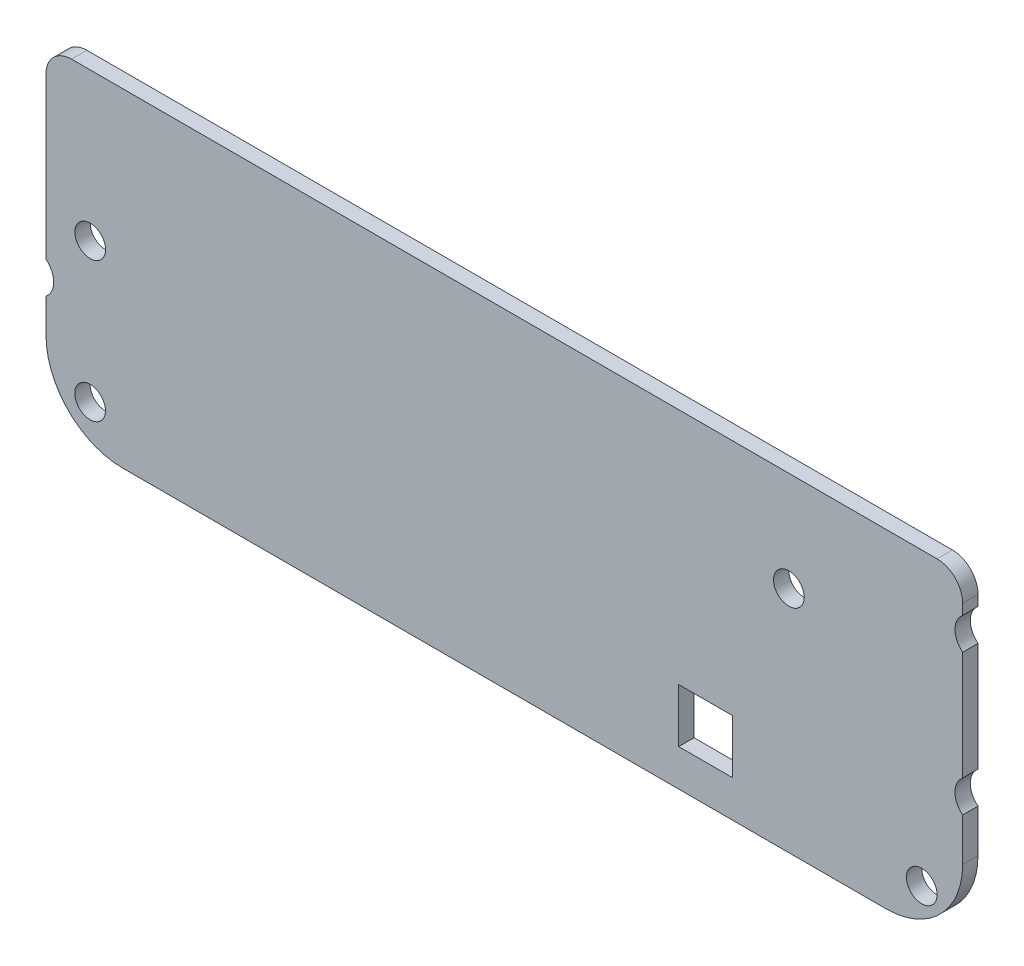
ISO-10303-21;
HEADER;
FILE_DESCRIPTION(('STEP AP214'),'2;1');
FILE_NAME('part.step','',(''),(''),'','','');
FILE_SCHEMA(('AUTOMOTIVE_DESIGN { 1 0 10303 214 1 1 1 1 }'));
ENDSEC;
DATA;
#1=APPLICATION_CONTEXT('core data for automotive mechanical design processes');
#2=APPLICATION_PROTOCOL_DEFINITION('international standard','automotive_design',2000,#1);
#3=PRODUCT_CONTEXT('',#1,'mechanical');
#4=PRODUCT('Part','Part','',(#3));
#5=PRODUCT_RELATED_PRODUCT_CATEGORY('part','',(#4));
#6=PRODUCT_DEFINITION_FORMATION('','',#4);
#7=PRODUCT_DEFINITION_CONTEXT('part definition',#1,'design');
#8=PRODUCT_DEFINITION('design','',#6,#7);
#9=PRODUCT_DEFINITION_SHAPE('','',#8);
#10=(LENGTH_UNIT() NAMED_UNIT(*) SI_UNIT(.MILLI.,.METRE.));
#11=(NAMED_UNIT(*) PLANE_ANGLE_UNIT() SI_UNIT($,.RADIAN.));
#12=(NAMED_UNIT(*) SI_UNIT($,.STERADIAN.) SOLID_ANGLE_UNIT());
#13=UNCERTAINTY_MEASURE_WITH_UNIT(LENGTH_MEASURE(1.E-05),#10,'distance_accuracy_value','');
#14=(GEOMETRIC_REPRESENTATION_CONTEXT(3) GLOBAL_UNCERTAINTY_ASSIGNED_CONTEXT((#13)) GLOBAL_UNIT_ASSIGNED_CONTEXT((#10,
#11,#12)) REPRESENTATION_CONTEXT('',''));
#15=CARTESIAN_POINT('',(0.,0.,0.));
#16=DIRECTION('',(0.,0.,1.));
#17=DIRECTION('',(1.,0.,0.));
#18=AXIS2_PLACEMENT_3D('',#15,#16,#17);
#19=CARTESIAN_POINT('',(103.101682981005,93.4022534083957,3.));
#20=DIRECTION('',(1.,0.,0.));
#21=DIRECTION('',(0.,1.,0.));
#22=AXIS2_PLACEMENT_3D('',#19,#20,#21);
#23=PLANE('',#22);
#24=DIRECTION('',(0.,-1.,0.));
#25=VECTOR('',#24,1.);
#26=CARTESIAN_POINT('',(103.101682981005,93.4022534083957,0.));
#27=LINE('',#26,#25);
#28=CARTESIAN_POINT('',(103.101682981005,137.632253408396,0.));
#29=VERTEX_POINT('',#28);
#30=CARTESIAN_POINT('',(103.101682981005,106.244752407595,0.));
#31=VERTEX_POINT('',#30);
#32=EDGE_CURVE('E281',#29,#31,#27,.T.);
#33=ORIENTED_EDGE('',*,*,#32,.T.);
#34=DIRECTION('',(0.,0.,1.));
#35=VECTOR('',#34,1.);
#36=CARTESIAN_POINT('',(103.101682981005,106.244752407595,-7.));
#37=LINE('',#36,#35);
#38=CARTESIAN_POINT('',(103.101682981005,106.244752407595,3.));
#39=VERTEX_POINT('',#38);
#40=EDGE_CURVE('E207',#31,#39,#37,.T.);
#41=ORIENTED_EDGE('',*,*,#40,.T.);
#42=DIRECTION('',(0.,-1.,0.));
#43=VECTOR('',#42,1.);
#44=CARTESIAN_POINT('',(103.101682981005,93.4022534083957,3.));
#45=LINE('',#44,#43);
#46=CARTESIAN_POINT('',(103.101682981005,137.632253408396,3.));
#47=VERTEX_POINT('',#46);
#48=EDGE_CURVE('E259',#47,#39,#45,.T.);
#49=ORIENTED_EDGE('',*,*,#48,.F.);
#50=DIRECTION('',(0.,0.,-1.));
#51=VECTOR('',#50,1.);
#52=CARTESIAN_POINT('',(103.101682981005,137.632253408396,3.));
#53=LINE('',#52,#51);
#54=EDGE_CURVE('E308',#47,#29,#53,.T.);
#55=ORIENTED_EDGE('',*,*,#54,.T.);
#56=EDGE_LOOP('',(#33,#41,#49,#55));
#57=FACE_BOUND('',#56,.T.);
#58=ADVANCED_FACE('F42',(#57),#23,.F.);
#59=CARTESIAN_POINT('',(282.271682981005,93.4022534083957,3.));
#60=DIRECTION('',(-1.,0.,0.));
#61=DIRECTION('',(0.,0.,1.));
#62=AXIS2_PLACEMENT_3D('',#59,#60,#61);
#63=PLANE('',#62);
#64=DIRECTION('',(0.,1.,0.));
#65=VECTOR('',#64,1.);
#66=CARTESIAN_POINT('',(282.271682981005,93.4022534083957,0.));
#67=LINE('',#66,#65);
#68=CARTESIAN_POINT('',(282.271682981005,108.024752407595,0.));
#69=VERTEX_POINT('',#68);
#70=CARTESIAN_POINT('',(282.271682981005,129.319754409196,0.));
#71=VERTEX_POINT('',#70);
#72=EDGE_CURVE('E293',#69,#71,#67,.T.);
#73=ORIENTED_EDGE('',*,*,#72,.T.);
#74=DIRECTION('',(0.,0.,1.));
#75=VECTOR('',#74,1.);
#76=CARTESIAN_POINT('',(282.271682981005,129.319754409196,-7.));
#77=LINE('',#76,#75);
#78=CARTESIAN_POINT('',(282.271682981005,129.319754409196,3.));
#79=VERTEX_POINT('',#78);
#80=EDGE_CURVE('E222',#71,#79,#77,.T.);
#81=ORIENTED_EDGE('',*,*,#80,.T.);
#82=DIRECTION('',(0.,1.,0.));
#83=VECTOR('',#82,1.);
#84=CARTESIAN_POINT('',(282.271682981005,93.4022534083957,3.));
#85=LINE('',#84,#83);
#86=CARTESIAN_POINT('',(282.271682981005,108.024752407595,3.));
#87=VERTEX_POINT('',#86);
#88=EDGE_CURVE('E273',#87,#79,#85,.T.);
#89=ORIENTED_EDGE('',*,*,#88,.F.);
#90=DIRECTION('',(0.,0.,1.));
#91=VECTOR('',#90,1.);
#92=CARTESIAN_POINT('',(282.271682981005,108.024752407595,-7.));
#93=LINE('',#92,#91);
#94=EDGE_CURVE('E214',#69,#87,#93,.T.);
#95=ORIENTED_EDGE('',*,*,#94,.F.);
#96=EDGE_LOOP('',(#73,#81,#89,#95));
#97=FACE_BOUND('',#96,.T.);
#98=ADVANCED_FACE('F368',(#97),#63,.F.);
#99=CARTESIAN_POINT('',(282.271682981005,93.4022534083957,0.));
#100=VERTEX_POINT('',#99);
#101=CARTESIAN_POINT('',(282.271682981005,101.779754409196,0.));
#102=VERTEX_POINT('',#101);
#103=EDGE_CURVE('E254',#100,#102,#67,.T.);
#104=ORIENTED_EDGE('',*,*,#103,.T.);
#105=DIRECTION('',(0.,0.,1.));
#106=VECTOR('',#105,1.);
#107=CARTESIAN_POINT('',(282.271682981005,101.779754409196,-7.));
#108=LINE('',#107,#106);
#109=CARTESIAN_POINT('',(282.271682981005,101.779754409196,3.));
#110=VERTEX_POINT('',#109);
#111=EDGE_CURVE('E215',#102,#110,#108,.T.);
#112=ORIENTED_EDGE('',*,*,#111,.T.);
#113=CARTESIAN_POINT('',(282.271682981005,93.4022534083957,3.));
#114=VERTEX_POINT('',#113);
#115=EDGE_CURVE('E269',#114,#110,#85,.T.);
#116=ORIENTED_EDGE('',*,*,#115,.F.);
#117=DIRECTION('',(0.,0.,-1.));
#118=VECTOR('',#117,1.);
#119=CARTESIAN_POINT('',(282.271682981005,93.4022534083957,3.));
#120=LINE('',#119,#118);
#121=EDGE_CURVE('E296',#114,#100,#120,.T.);
#122=ORIENTED_EDGE('',*,*,#121,.T.);
#123=EDGE_LOOP('',(#104,#112,#116,#122));
#124=FACE_BOUND('',#123,.T.);
#125=ADVANCED_FACE('F374',(#124),#63,.F.);
#126=CARTESIAN_POINT('',(277.271682981005,137.632253408396,3.));
#127=DIRECTION('',(0.,0.,-1.));
#128=DIRECTION('',(-1.,0.,0.));
#129=AXIS2_PLACEMENT_3D('',#126,#127,#128);
#130=CYLINDRICAL_SURFACE('',#129,5.);
#131=CARTESIAN_POINT('',(277.271682981005,137.632253408396,0.));
#132=DIRECTION('',(0.,0.,1.));
#133=DIRECTION('',(-1.,0.,0.));
#134=AXIS2_PLACEMENT_3D('',#131,#132,#133);
#135=CIRCLE('',#134,5.);
#136=CARTESIAN_POINT('',(282.271682981005,137.632253408396,0.));
#137=VERTEX_POINT('',#136);
#138=CARTESIAN_POINT('',(277.271682981005,142.632253408396,0.));
#139=VERTEX_POINT('',#138);
#140=EDGE_CURVE('E249',#137,#139,#135,.T.);
#141=ORIENTED_EDGE('',*,*,#140,.T.);
#142=DIRECTION('',(0.,0.,-1.));
#143=VECTOR('',#142,1.);
#144=CARTESIAN_POINT('',(277.271682981005,142.632253408396,3.));
#145=LINE('',#144,#143);
#146=CARTESIAN_POINT('',(277.271682981005,142.632253408396,3.));
#147=VERTEX_POINT('',#146);
#148=EDGE_CURVE('E314',#147,#139,#145,.T.);
#149=ORIENTED_EDGE('',*,*,#148,.F.);
#150=CARTESIAN_POINT('',(277.271682981005,137.632253408396,3.));
#151=DIRECTION('',(0.,0.,1.));
#152=DIRECTION('',(-1.,0.,0.));
#153=AXIS2_PLACEMENT_3D('',#150,#151,#152);
#154=CIRCLE('',#153,5.);
#155=CARTESIAN_POINT('',(282.271682981005,137.632253408396,3.));
#156=VERTEX_POINT('',#155);
#157=EDGE_CURVE('E250',#156,#147,#154,.T.);
#158=ORIENTED_EDGE('',*,*,#157,.F.);
#159=DIRECTION('',(0.,0.,-1.));
#160=VECTOR('',#159,1.);
#161=CARTESIAN_POINT('',(282.271682981005,137.632253408396,3.));
#162=LINE('',#161,#160);
#163=EDGE_CURVE('E272',#156,#137,#162,.T.);
#164=ORIENTED_EDGE('',*,*,#163,.T.);
#165=EDGE_LOOP('',(#141,#149,#158,#164));
#166=FACE_BOUND('',#165,.T.);
#167=ADVANCED_FACE('F44',(#166),#130,.T.);
#168=CARTESIAN_POINT('',(108.101682981005,142.632253408396,3.));
#169=DIRECTION('',(0.,-1.,0.));
#170=DIRECTION('',(0.,0.,-1.));
#171=AXIS2_PLACEMENT_3D('',#168,#169,#170);
#172=PLANE('',#171);
#173=DIRECTION('',(-1.,0.,0.));
#174=VECTOR('',#173,1.);
#175=CARTESIAN_POINT('',(108.101682981005,142.632253408396,0.));
#176=LINE('',#175,#174);
#177=CARTESIAN_POINT('',(108.101682981005,142.632253408396,0.));
#178=VERTEX_POINT('',#177);
#179=EDGE_CURVE('E276',#139,#178,#176,.T.);
#180=ORIENTED_EDGE('',*,*,#179,.T.);
#181=DIRECTION('',(0.,0.,-1.));
#182=VECTOR('',#181,1.);
#183=CARTESIAN_POINT('',(108.101682981005,142.632253408396,3.));
#184=LINE('',#183,#182);
#185=CARTESIAN_POINT('',(108.101682981005,142.632253408396,3.));
#186=VERTEX_POINT('',#185);
#187=EDGE_CURVE('E311',#186,#178,#184,.T.);
#188=ORIENTED_EDGE('',*,*,#187,.F.);
#189=DIRECTION('',(-1.,0.,0.));
#190=VECTOR('',#189,1.);
#191=CARTESIAN_POINT('',(108.101682981005,142.632253408396,3.));
#192=LINE('',#191,#190);
#193=EDGE_CURVE('E253',#147,#186,#192,.T.);
#194=ORIENTED_EDGE('',*,*,#193,.F.);
#195=ORIENTED_EDGE('',*,*,#148,.T.);
#196=EDGE_LOOP('',(#180,#188,#194,#195));
#197=FACE_BOUND('',#196,.T.);
#198=ADVANCED_FACE('F357',(#197),#172,.F.);
#199=CARTESIAN_POINT('',(108.101682981005,137.632253408396,3.));
#200=DIRECTION('',(0.,0.,-1.));
#201=DIRECTION('',(-1.,0.,0.));
#202=AXIS2_PLACEMENT_3D('',#199,#200,#201);
#203=CYLINDRICAL_SURFACE('',#202,5.);
#204=CARTESIAN_POINT('',(108.101682981005,137.632253408396,0.));
#205=DIRECTION('',(0.,0.,1.));
#206=DIRECTION('',(-1.,0.,0.));
#207=AXIS2_PLACEMENT_3D('',#204,#205,#206);
#208=CIRCLE('',#207,5.);
#209=EDGE_CURVE('E278',#178,#29,#208,.T.);
#210=ORIENTED_EDGE('',*,*,#209,.T.);
#211=ORIENTED_EDGE('',*,*,#54,.F.);
#212=CARTESIAN_POINT('',(108.101682981005,137.632253408396,3.));
#213=DIRECTION('',(0.,0.,1.));
#214=DIRECTION('',(-1.,0.,0.));
#215=AXIS2_PLACEMENT_3D('',#212,#213,#214);
#216=CIRCLE('',#215,5.);
#217=EDGE_CURVE('E256',#186,#47,#216,.T.);
#218=ORIENTED_EDGE('',*,*,#217,.F.);
#219=ORIENTED_EDGE('',*,*,#187,.T.);
#220=EDGE_LOOP('',(#210,#211,#218,#219));
#221=FACE_BOUND('',#220,.T.);
#222=ADVANCED_FACE('F353',(#221),#203,.T.);
#223=CARTESIAN_POINT('',(103.101682981005,99.9997544091964,3.));
#224=VERTEX_POINT('',#223);
#225=CARTESIAN_POINT('',(103.101682981005,93.4022534083957,3.));
#226=VERTEX_POINT('',#225);
#227=EDGE_CURVE('E258',#224,#226,#45,.T.);
#228=ORIENTED_EDGE('',*,*,#227,.F.);
#229=DIRECTION('',(0.,0.,1.));
#230=VECTOR('',#229,1.);
#231=CARTESIAN_POINT('',(103.101682981005,99.9997544091964,-7.));
#232=LINE('',#231,#230);
#233=CARTESIAN_POINT('',(103.101682981005,99.9997544091964,0.));
#234=VERTEX_POINT('',#233);
#235=EDGE_CURVE('E204',#234,#224,#232,.T.);
#236=ORIENTED_EDGE('',*,*,#235,.F.);
#237=CARTESIAN_POINT('',(103.101682981005,93.4022534083957,0.));
#238=VERTEX_POINT('',#237);
#239=EDGE_CURVE('E280',#234,#238,#27,.T.);
#240=ORIENTED_EDGE('',*,*,#239,.T.);
#241=DIRECTION('',(0.,0.,-1.));
#242=VECTOR('',#241,1.);
#243=CARTESIAN_POINT('',(103.101682981005,93.4022534083957,3.));
#244=LINE('',#243,#242);
#245=EDGE_CURVE('E305',#226,#238,#244,.T.);
#246=ORIENTED_EDGE('',*,*,#245,.F.);
#247=EDGE_LOOP('',(#228,#236,#240,#246));
#248=FACE_BOUND('',#247,.T.);
#249=ADVANCED_FACE('F327',(#248),#23,.F.);
#250=CARTESIAN_POINT('',(118.101682981005,93.4022534083957,3.));
#251=DIRECTION('',(0.,0.,-1.));
#252=DIRECTION('',(-1.,0.,0.));
#253=AXIS2_PLACEMENT_3D('',#250,#251,#252);
#254=CYLINDRICAL_SURFACE('',#253,15.);
#255=CARTESIAN_POINT('',(118.101682981005,93.4022534083957,0.));
#256=DIRECTION('',(0.,0.,1.));
#257=DIRECTION('',(-1.,0.,0.));
#258=AXIS2_PLACEMENT_3D('',#255,#256,#257);
#259=CIRCLE('',#258,15.);
#260=CARTESIAN_POINT('',(118.101682981005,78.4022534083957,0.));
#261=VERTEX_POINT('',#260);
#262=EDGE_CURVE('E284',#238,#261,#259,.T.);
#263=ORIENTED_EDGE('',*,*,#262,.T.);
#264=DIRECTION('',(0.,0.,-1.));
#265=VECTOR('',#264,1.);
#266=CARTESIAN_POINT('',(118.101682981005,78.4022534083957,3.));
#267=LINE('',#266,#265);
#268=CARTESIAN_POINT('',(118.101682981005,78.4022534083957,3.));
#269=VERTEX_POINT('',#268);
#270=EDGE_CURVE('E302',#269,#261,#267,.T.);
#271=ORIENTED_EDGE('',*,*,#270,.F.);
#272=CARTESIAN_POINT('',(118.101682981005,93.4022534083957,3.));
#273=DIRECTION('',(0.,0.,1.));
#274=DIRECTION('',(-1.,0.,0.));
#275=AXIS2_PLACEMENT_3D('',#272,#273,#274);
#276=CIRCLE('',#275,15.);
#277=EDGE_CURVE('E262',#226,#269,#276,.T.);
#278=ORIENTED_EDGE('',*,*,#277,.F.);
#279=ORIENTED_EDGE('',*,*,#245,.T.);
#280=EDGE_LOOP('',(#263,#271,#278,#279));
#281=FACE_BOUND('',#280,.T.);
#282=ADVANCED_FACE('F336',(#281),#254,.T.);
#283=CARTESIAN_POINT('',(118.101682981005,78.4022534083957,3.));
#284=DIRECTION('',(0.,1.,0.));
#285=DIRECTION('',(0.,0.,1.));
#286=AXIS2_PLACEMENT_3D('',#283,#284,#285);
#287=PLANE('',#286);
#288=DIRECTION('',(1.,0.,0.));
#289=VECTOR('',#288,1.);
#290=CARTESIAN_POINT('',(118.101682981005,78.4022534083957,0.));
#291=LINE('',#290,#289);
#292=CARTESIAN_POINT('',(267.271682981005,78.4022534083957,0.));
#293=VERTEX_POINT('',#292);
#294=EDGE_CURVE('E286',#261,#293,#291,.T.);
#295=ORIENTED_EDGE('',*,*,#294,.T.);
#296=DIRECTION('',(0.,0.,-1.));
#297=VECTOR('',#296,1.);
#298=CARTESIAN_POINT('',(267.271682981005,78.4022534083957,3.));
#299=LINE('',#298,#297);
#300=CARTESIAN_POINT('',(267.271682981005,78.4022534083957,3.));
#301=VERTEX_POINT('',#300);
#302=EDGE_CURVE('E299',#301,#293,#299,.T.);
#303=ORIENTED_EDGE('',*,*,#302,.F.);
#304=DIRECTION('',(1.,0.,0.));
#305=VECTOR('',#304,1.);
#306=CARTESIAN_POINT('',(118.101682981005,78.4022534083957,3.));
#307=LINE('',#306,#305);
#308=EDGE_CURVE('E264',#269,#301,#307,.T.);
#309=ORIENTED_EDGE('',*,*,#308,.F.);
#310=ORIENTED_EDGE('',*,*,#270,.T.);
#311=EDGE_LOOP('',(#295,#303,#309,#310));
#312=FACE_BOUND('',#311,.T.);
#313=ADVANCED_FACE('F340',(#312),#287,.F.);
#314=CARTESIAN_POINT('',(267.271682981005,93.4022534083957,3.));
#315=DIRECTION('',(0.,0.,-1.));
#316=DIRECTION('',(-1.,0.,0.));
#317=AXIS2_PLACEMENT_3D('',#314,#315,#316);
#318=CYLINDRICAL_SURFACE('',#317,15.);
#319=CARTESIAN_POINT('',(267.271682981005,93.4022534083957,0.));
#320=DIRECTION('',(0.,0.,1.));
#321=DIRECTION('',(1.,0.,0.));
#322=AXIS2_PLACEMENT_3D('',#319,#320,#321);
#323=CIRCLE('',#322,15.);
#324=EDGE_CURVE('E288',#293,#100,#323,.T.);
#325=ORIENTED_EDGE('',*,*,#324,.T.);
#326=ORIENTED_EDGE('',*,*,#121,.F.);
#327=CARTESIAN_POINT('',(267.271682981005,93.4022534083957,3.));
#328=DIRECTION('',(0.,0.,1.));
#329=DIRECTION('',(1.,0.,0.));
#330=AXIS2_PLACEMENT_3D('',#327,#328,#329);
#331=CIRCLE('',#330,15.);
#332=EDGE_CURVE('E266',#301,#114,#331,.T.);
#333=ORIENTED_EDGE('',*,*,#332,.F.);
#334=ORIENTED_EDGE('',*,*,#302,.T.);
#335=EDGE_LOOP('',(#325,#326,#333,#334));
#336=FACE_BOUND('',#335,.T.);
#337=ADVANCED_FACE('F377',(#336),#318,.T.);
#338=CARTESIAN_POINT('',(282.271682981005,135.564752407595,3.));
#339=VERTEX_POINT('',#338);
#340=EDGE_CURVE('E268',#339,#156,#85,.T.);
#341=ORIENTED_EDGE('',*,*,#340,.F.);
#342=DIRECTION('',(0.,0.,1.));
#343=VECTOR('',#342,1.);
#344=CARTESIAN_POINT('',(282.271682981005,135.564752407595,-7.));
#345=LINE('',#344,#343);
#346=CARTESIAN_POINT('',(282.271682981005,135.564752407595,0.));
#347=VERTEX_POINT('',#346);
#348=EDGE_CURVE('E218',#339,#347,#345,.F.);
#349=ORIENTED_EDGE('',*,*,#348,.T.);
#350=EDGE_CURVE('E290',#347,#137,#67,.T.);
#351=ORIENTED_EDGE('',*,*,#350,.T.);
#352=ORIENTED_EDGE('',*,*,#163,.F.);
#353=EDGE_LOOP('',(#341,#349,#351,#352));
#354=FACE_BOUND('',#353,.T.);
#355=ADVANCED_FACE('F379',(#354),#63,.F.);
#356=CARTESIAN_POINT('',(277.271682981005,137.632253408396,3.));
#357=DIRECTION('',(0.,0.,-1.));
#358=DIRECTION('',(-1.,0.,0.));
#359=AXIS2_PLACEMENT_3D('',#356,#357,#358);
#360=PLANE('',#359);
#361=DIRECTION('',(1.,0.,0.));
#362=VECTOR('',#361,1.);
#363=CARTESIAN_POINT('',(277.271682981005,96.1022534083957,3.));
#364=LINE('',#363,#362);
#365=CARTESIAN_POINT('',(226.771682981005,96.1022534083957,3.));
#366=VERTEX_POINT('',#365);
#367=CARTESIAN_POINT('',(237.271682981005,96.1022534083957,3.));
#368=VERTEX_POINT('',#367);
#369=EDGE_CURVE('E197',#366,#368,#364,.T.);
#370=ORIENTED_EDGE('',*,*,#369,.T.);
#371=DIRECTION('',(0.,-1.,0.));
#372=VECTOR('',#371,1.);
#373=CARTESIAN_POINT('',(237.271682981005,137.632253408396,3.));
#374=LINE('',#373,#372);
#375=CARTESIAN_POINT('',(237.271682981005,85.6022534083957,3.));
#376=VERTEX_POINT('',#375);
#377=EDGE_CURVE('E200',#368,#376,#374,.T.);
#378=ORIENTED_EDGE('',*,*,#377,.T.);
#379=DIRECTION('',(-1.,0.,0.));
#380=VECTOR('',#379,1.);
#381=CARTESIAN_POINT('',(277.271682981005,85.6022534083957,3.));
#382=LINE('',#381,#380);
#383=CARTESIAN_POINT('',(226.771682981005,85.6022534083957,3.));
#384=VERTEX_POINT('',#383);
#385=EDGE_CURVE('E192',#376,#384,#382,.T.);
#386=ORIENTED_EDGE('',*,*,#385,.T.);
#387=DIRECTION('',(0.,1.,0.));
#388=VECTOR('',#387,1.);
#389=CARTESIAN_POINT('',(226.771682981005,137.632253408396,3.));
#390=LINE('',#389,#388);
#391=EDGE_CURVE('E172',#384,#366,#390,.T.);
#392=ORIENTED_EDGE('',*,*,#391,.T.);
#393=EDGE_LOOP('',(#370,#378,#386,#392));
#394=FACE_BOUND('',#393,.T.);
#395=CARTESIAN_POINT('',(274.271682981005,85.7522534083956,3.));
#396=DIRECTION('',(0.,0.,-1.));
#397=DIRECTION('',(-1.,0.,0.));
#398=AXIS2_PLACEMENT_3D('',#395,#396,#397);
#399=CIRCLE('',#398,2.99999999999999);
#400=CARTESIAN_POINT('',(271.271682981005,85.7522534083956,3.));
#401=VERTEX_POINT('',#400);
#402=EDGE_CURVE('E246',#401,#401,#399,.T.);
#403=ORIENTED_EDGE('',*,*,#402,.T.);
#404=EDGE_LOOP('',(#403));
#405=FACE_BOUND('',#404,.T.);
#406=CARTESIAN_POINT('',(248.301682981005,123.122253408396,3.));
#407=DIRECTION('',(0.,0.,-1.));
#408=DIRECTION('',(-1.,0.,0.));
#409=AXIS2_PLACEMENT_3D('',#406,#407,#408);
#410=CIRCLE('',#409,2.99999999999999);
#411=CARTESIAN_POINT('',(245.301682981005,123.122253408396,3.));
#412=VERTEX_POINT('',#411);
#413=EDGE_CURVE('E243',#412,#412,#410,.T.);
#414=ORIENTED_EDGE('',*,*,#413,.T.);
#415=EDGE_LOOP('',(#414));
#416=FACE_BOUND('',#415,.T.);
#417=CARTESIAN_POINT('',(111.721682981005,86.4022534083957,3.));
#418=DIRECTION('',(0.,0.,-1.));
#419=DIRECTION('',(-1.,0.,0.));
#420=AXIS2_PLACEMENT_3D('',#417,#418,#419);
#421=CIRCLE('',#420,3.00000000000001);
#422=CARTESIAN_POINT('',(108.721682981005,86.4022534083957,3.));
#423=VERTEX_POINT('',#422);
#424=EDGE_CURVE('E240',#423,#423,#421,.T.);
#425=ORIENTED_EDGE('',*,*,#424,.T.);
#426=EDGE_LOOP('',(#425));
#427=FACE_BOUND('',#426,.T.);
#428=CARTESIAN_POINT('',(111.741682981005,113.692253408396,3.));
#429=DIRECTION('',(0.,0.,-1.));
#430=DIRECTION('',(-1.,0.,0.));
#431=AXIS2_PLACEMENT_3D('',#428,#429,#430);
#432=CIRCLE('',#431,3.00000000000001);
#433=CARTESIAN_POINT('',(108.741682981005,113.692253408396,3.));
#434=VERTEX_POINT('',#433);
#435=EDGE_CURVE('E237',#434,#434,#432,.T.);
#436=ORIENTED_EDGE('',*,*,#435,.T.);
#437=EDGE_LOOP('',(#436));
#438=FACE_BOUND('',#437,.T.);
#439=ORIENTED_EDGE('',*,*,#88,.T.);
#440=CARTESIAN_POINT('',(284.771682981005,132.442253408396,3.));
#441=DIRECTION('',(0.,0.,1.));
#442=DIRECTION('',(1.,0.,0.));
#443=AXIS2_PLACEMENT_3D('',#440,#441,#442);
#444=CIRCLE('',#443,3.99999999999999);
#445=EDGE_CURVE('E203',#339,#79,#444,.T.);
#446=ORIENTED_EDGE('',*,*,#445,.F.);
#447=ORIENTED_EDGE('',*,*,#340,.T.);
#448=ORIENTED_EDGE('',*,*,#157,.T.);
#449=ORIENTED_EDGE('',*,*,#193,.T.);
#450=ORIENTED_EDGE('',*,*,#217,.T.);
#451=ORIENTED_EDGE('',*,*,#48,.T.);
#452=CARTESIAN_POINT('',(100.601682981005,103.122253408396,3.));
#453=DIRECTION('',(0.,0.,1.));
#454=DIRECTION('',(1.,0.,0.));
#455=AXIS2_PLACEMENT_3D('',#452,#453,#454);
#456=CIRCLE('',#455,4.00000000000001);
#457=EDGE_CURVE('E206',#224,#39,#456,.T.);
#458=ORIENTED_EDGE('',*,*,#457,.F.);
#459=ORIENTED_EDGE('',*,*,#227,.T.);
#460=ORIENTED_EDGE('',*,*,#277,.T.);
#461=ORIENTED_EDGE('',*,*,#308,.T.);
#462=ORIENTED_EDGE('',*,*,#332,.T.);
#463=ORIENTED_EDGE('',*,*,#115,.T.);
#464=CARTESIAN_POINT('',(284.771682981005,104.902253408396,3.));
#465=DIRECTION('',(0.,0.,1.));
#466=DIRECTION('',(1.,0.,0.));
#467=AXIS2_PLACEMENT_3D('',#464,#465,#466);
#468=CIRCLE('',#467,3.99999999999999);
#469=EDGE_CURVE('E211',#87,#110,#468,.T.);
#470=ORIENTED_EDGE('',*,*,#469,.F.);
#471=EDGE_LOOP('',(#439,#446,#447,#448,#449,#450,#451,#458,#459,#460,#461,#462,#463,#470));
#472=FACE_BOUND('',#471,.T.);
#473=ADVANCED_FACE('F345',(#394,#405,#416,#427,#438,#472),#360,.F.);
#474=CARTESIAN_POINT('',(277.271682981005,137.632253408396,0.));
#475=DIRECTION('',(0.,0.,-1.));
#476=DIRECTION('',(-1.,0.,0.));
#477=AXIS2_PLACEMENT_3D('',#474,#475,#476);
#478=PLANE('',#477);
#479=DIRECTION('',(0.,-1.,0.));
#480=VECTOR('',#479,1.);
#481=CARTESIAN_POINT('',(237.271682981005,85.6022534083957,0.));
#482=LINE('',#481,#480);
#483=CARTESIAN_POINT('',(237.271682981005,96.1022534083957,0.));
#484=VERTEX_POINT('',#483);
#485=CARTESIAN_POINT('',(237.271682981005,85.6022534083957,0.));
#486=VERTEX_POINT('',#485);
#487=EDGE_CURVE('E65',#484,#486,#482,.T.);
#488=ORIENTED_EDGE('',*,*,#487,.F.);
#489=DIRECTION('',(1.,0.,0.));
#490=VECTOR('',#489,1.);
#491=CARTESIAN_POINT('',(237.271682981005,96.1022534083957,0.));
#492=LINE('',#491,#490);
#493=CARTESIAN_POINT('',(226.771682981005,96.1022534083957,0.));
#494=VERTEX_POINT('',#493);
#495=EDGE_CURVE('E185',#494,#484,#492,.T.);
#496=ORIENTED_EDGE('',*,*,#495,.F.);
#497=DIRECTION('',(0.,1.,0.));
#498=VECTOR('',#497,1.);
#499=CARTESIAN_POINT('',(226.771682981005,85.6022534083957,0.));
#500=LINE('',#499,#498);
#501=CARTESIAN_POINT('',(226.771682981005,85.6022534083957,0.));
#502=VERTEX_POINT('',#501);
#503=EDGE_CURVE('E169',#502,#494,#500,.T.);
#504=ORIENTED_EDGE('',*,*,#503,.F.);
#505=DIRECTION('',(-1.,0.,0.));
#506=VECTOR('',#505,1.);
#507=CARTESIAN_POINT('',(237.271682981005,85.6022534083957,0.));
#508=LINE('',#507,#506);
#509=EDGE_CURVE('E178',#486,#502,#508,.T.);
#510=ORIENTED_EDGE('',*,*,#509,.F.);
#511=EDGE_LOOP('',(#488,#496,#504,#510));
#512=FACE_BOUND('',#511,.T.);
#513=CARTESIAN_POINT('',(284.771682981005,132.442253408396,0.));
#514=DIRECTION('',(0.,0.,-1.));
#515=DIRECTION('',(-1.,0.,0.));
#516=AXIS2_PLACEMENT_3D('',#513,#514,#515);
#517=CIRCLE('',#516,3.99999999999999);
#518=EDGE_CURVE('E12',#71,#347,#517,.T.);
#519=ORIENTED_EDGE('',*,*,#518,.F.);
#520=ORIENTED_EDGE('',*,*,#72,.F.);
#521=CARTESIAN_POINT('',(284.771682981005,104.902253408396,0.));
#522=DIRECTION('',(0.,0.,-1.));
#523=DIRECTION('',(-1.,0.,0.));
#524=AXIS2_PLACEMENT_3D('',#521,#522,#523);
#525=CIRCLE('',#524,3.99999999999999);
#526=EDGE_CURVE('E317',#102,#69,#525,.T.);
#527=ORIENTED_EDGE('',*,*,#526,.F.);
#528=ORIENTED_EDGE('',*,*,#103,.F.);
#529=ORIENTED_EDGE('',*,*,#324,.F.);
#530=ORIENTED_EDGE('',*,*,#294,.F.);
#531=ORIENTED_EDGE('',*,*,#262,.F.);
#532=ORIENTED_EDGE('',*,*,#239,.F.);
#533=CARTESIAN_POINT('',(100.601682981005,103.122253408396,0.));
#534=DIRECTION('',(0.,0.,-1.));
#535=DIRECTION('',(-1.,0.,0.));
#536=AXIS2_PLACEMENT_3D('',#533,#534,#535);
#537=CIRCLE('',#536,4.00000000000001);
#538=EDGE_CURVE('E50',#31,#234,#537,.T.);
#539=ORIENTED_EDGE('',*,*,#538,.F.);
#540=ORIENTED_EDGE('',*,*,#32,.F.);
#541=ORIENTED_EDGE('',*,*,#209,.F.);
#542=ORIENTED_EDGE('',*,*,#179,.F.);
#543=ORIENTED_EDGE('',*,*,#140,.F.);
#544=ORIENTED_EDGE('',*,*,#350,.F.);
#545=EDGE_LOOP('',(#519,#520,#527,#528,#529,#530,#531,#532,#539,#540,#541,#542,#543,#544));
#546=FACE_BOUND('',#545,.T.);
#547=CARTESIAN_POINT('',(274.271682981005,85.7522534083956,0.));
#548=DIRECTION('',(0.,0.,-1.));
#549=DIRECTION('',(-1.,0.,0.));
#550=AXIS2_PLACEMENT_3D('',#547,#548,#549);
#551=CIRCLE('',#550,2.99999999999999);
#552=CARTESIAN_POINT('',(271.271682981005,85.7522534083956,0.));
#553=VERTEX_POINT('',#552);
#554=EDGE_CURVE('E225',#553,#553,#551,.T.);
#555=ORIENTED_EDGE('',*,*,#554,.F.);
#556=EDGE_LOOP('',(#555));
#557=FACE_BOUND('',#556,.T.);
#558=CARTESIAN_POINT('',(248.301682981005,123.122253408396,0.));
#559=DIRECTION('',(0.,0.,-1.));
#560=DIRECTION('',(-1.,0.,0.));
#561=AXIS2_PLACEMENT_3D('',#558,#559,#560);
#562=CIRCLE('',#561,2.99999999999999);
#563=CARTESIAN_POINT('',(245.301682981005,123.122253408396,0.));
#564=VERTEX_POINT('',#563);
#565=EDGE_CURVE('E230',#564,#564,#562,.T.);
#566=ORIENTED_EDGE('',*,*,#565,.F.);
#567=EDGE_LOOP('',(#566));
#568=FACE_BOUND('',#567,.T.);
#569=CARTESIAN_POINT('',(111.721682981005,86.4022534083957,0.));
#570=DIRECTION('',(0.,0.,-1.));
#571=DIRECTION('',(-1.,0.,0.));
#572=AXIS2_PLACEMENT_3D('',#569,#570,#571);
#573=CIRCLE('',#572,3.00000000000001);
#574=CARTESIAN_POINT('',(108.721682981005,86.4022534083957,0.));
#575=VERTEX_POINT('',#574);
#576=EDGE_CURVE('E226',#575,#575,#573,.T.);
#577=ORIENTED_EDGE('',*,*,#576,.F.);
#578=EDGE_LOOP('',(#577));
#579=FACE_BOUND('',#578,.T.);
#580=CARTESIAN_POINT('',(111.741682981005,113.692253408396,0.));
#581=DIRECTION('',(0.,0.,-1.));
#582=DIRECTION('',(-1.,0.,0.));
#583=AXIS2_PLACEMENT_3D('',#580,#581,#582);
#584=CIRCLE('',#583,3.00000000000001);
#585=CARTESIAN_POINT('',(108.741682981005,113.692253408396,0.));
#586=VERTEX_POINT('',#585);
#587=EDGE_CURVE('E229',#586,#586,#584,.T.);
#588=ORIENTED_EDGE('',*,*,#587,.F.);
#589=EDGE_LOOP('',(#588));
#590=FACE_BOUND('',#589,.T.);
#591=ADVANCED_FACE('F182',(#512,#546,#557,#568,#579,#590),#478,.T.);
#592=CARTESIAN_POINT('',(111.741682981005,113.692253408396,10.));
#593=DIRECTION('',(0.,0.,-1.));
#594=DIRECTION('',(-1.,0.,0.));
#595=AXIS2_PLACEMENT_3D('',#592,#593,#594);
#596=CYLINDRICAL_SURFACE('',#595,3.00000000000001);
#597=ORIENTED_EDGE('',*,*,#587,.T.);
#598=EDGE_LOOP('',(#597));
#599=FACE_BOUND('',#598,.T.);
#600=ORIENTED_EDGE('',*,*,#435,.F.);
#601=EDGE_LOOP('',(#600));
#602=FACE_BOUND('',#601,.T.);
#603=ADVANCED_FACE('F413',(#599,#602),#596,.F.);
#604=CARTESIAN_POINT('',(111.721682981005,86.4022534083957,10.));
#605=DIRECTION('',(0.,0.,-1.));
#606=DIRECTION('',(-1.,0.,0.));
#607=AXIS2_PLACEMENT_3D('',#604,#605,#606);
#608=CYLINDRICAL_SURFACE('',#607,3.00000000000001);
#609=ORIENTED_EDGE('',*,*,#576,.T.);
#610=EDGE_LOOP('',(#609));
#611=FACE_BOUND('',#610,.T.);
#612=ORIENTED_EDGE('',*,*,#424,.F.);
#613=EDGE_LOOP('',(#612));
#614=FACE_BOUND('',#613,.T.);
#615=ADVANCED_FACE('F419',(#611,#614),#608,.F.);
#616=CARTESIAN_POINT('',(248.301682981005,123.122253408396,10.));
#617=DIRECTION('',(0.,0.,-1.));
#618=DIRECTION('',(-1.,0.,0.));
#619=AXIS2_PLACEMENT_3D('',#616,#617,#618);
#620=CYLINDRICAL_SURFACE('',#619,2.99999999999999);
#621=ORIENTED_EDGE('',*,*,#565,.T.);
#622=EDGE_LOOP('',(#621));
#623=FACE_BOUND('',#622,.T.);
#624=ORIENTED_EDGE('',*,*,#413,.F.);
#625=EDGE_LOOP('',(#624));
#626=FACE_BOUND('',#625,.T.);
#627=ADVANCED_FACE('F425',(#623,#626),#620,.F.);
#628=CARTESIAN_POINT('',(274.271682981005,85.7522534083956,10.));
#629=DIRECTION('',(0.,0.,-1.));
#630=DIRECTION('',(-1.,0.,0.));
#631=AXIS2_PLACEMENT_3D('',#628,#629,#630);
#632=CYLINDRICAL_SURFACE('',#631,2.99999999999999);
#633=ORIENTED_EDGE('',*,*,#554,.T.);
#634=EDGE_LOOP('',(#633));
#635=FACE_BOUND('',#634,.T.);
#636=ORIENTED_EDGE('',*,*,#402,.F.);
#637=EDGE_LOOP('',(#636));
#638=FACE_BOUND('',#637,.T.);
#639=ADVANCED_FACE('F421',(#635,#638),#632,.F.);
#640=CARTESIAN_POINT('',(284.771682981005,104.902253408396,-7.));
#641=DIRECTION('',(0.,0.,1.));
#642=DIRECTION('',(1.,0.,0.));
#643=AXIS2_PLACEMENT_3D('',#640,#641,#642);
#644=CYLINDRICAL_SURFACE('',#643,3.99999999999999);
#645=ORIENTED_EDGE('',*,*,#526,.T.);
#646=ORIENTED_EDGE('',*,*,#94,.T.);
#647=ORIENTED_EDGE('',*,*,#469,.T.);
#648=ORIENTED_EDGE('',*,*,#111,.F.);
#649=EDGE_LOOP('',(#645,#646,#647,#648));
#650=FACE_BOUND('',#649,.T.);
#651=ADVANCED_FACE('F424',(#650),#644,.F.);
#652=CARTESIAN_POINT('',(100.601682981005,103.122253408396,-7.));
#653=DIRECTION('',(0.,0.,1.));
#654=DIRECTION('',(1.,0.,0.));
#655=AXIS2_PLACEMENT_3D('',#652,#653,#654);
#656=CYLINDRICAL_SURFACE('',#655,4.00000000000001);
#657=ORIENTED_EDGE('',*,*,#538,.T.);
#658=ORIENTED_EDGE('',*,*,#235,.T.);
#659=ORIENTED_EDGE('',*,*,#457,.T.);
#660=ORIENTED_EDGE('',*,*,#40,.F.);
#661=EDGE_LOOP('',(#657,#658,#659,#660));
#662=FACE_BOUND('',#661,.T.);
#663=ADVANCED_FACE('F321',(#662),#656,.F.);
#664=CARTESIAN_POINT('',(284.771682981005,132.442253408396,-7.));
#665=DIRECTION('',(0.,0.,1.));
#666=DIRECTION('',(1.,0.,0.));
#667=AXIS2_PLACEMENT_3D('',#664,#665,#666);
#668=CYLINDRICAL_SURFACE('',#667,3.99999999999999);
#669=ORIENTED_EDGE('',*,*,#518,.T.);
#670=ORIENTED_EDGE('',*,*,#348,.F.);
#671=ORIENTED_EDGE('',*,*,#445,.T.);
#672=ORIENTED_EDGE('',*,*,#80,.F.);
#673=EDGE_LOOP('',(#669,#670,#671,#672));
#674=FACE_BOUND('',#673,.T.);
#675=ADVANCED_FACE('F435',(#674),#668,.F.);
#676=CARTESIAN_POINT('',(237.271682981005,85.6022534083957,10.));
#677=DIRECTION('',(1.,0.,0.));
#678=DIRECTION('',(0.,0.,-1.));
#679=AXIS2_PLACEMENT_3D('',#676,#677,#678);
#680=PLANE('',#679);
#681=DIRECTION('',(0.,0.,-1.));
#682=VECTOR('',#681,1.);
#683=CARTESIAN_POINT('',(237.271682981005,96.1022534083957,10.));
#684=LINE('',#683,#682);
#685=EDGE_CURVE('E190',#368,#484,#684,.T.);
#686=ORIENTED_EDGE('',*,*,#685,.T.);
#687=ORIENTED_EDGE('',*,*,#487,.T.);
#688=DIRECTION('',(0.,0.,-1.));
#689=VECTOR('',#688,1.);
#690=CARTESIAN_POINT('',(237.271682981005,85.6022534083957,10.));
#691=LINE('',#690,#689);
#692=EDGE_CURVE('E175',#376,#486,#691,.T.);
#693=ORIENTED_EDGE('',*,*,#692,.F.);
#694=ORIENTED_EDGE('',*,*,#377,.F.);
#695=EDGE_LOOP('',(#686,#687,#693,#694));
#696=FACE_BOUND('',#695,.T.);
#697=ADVANCED_FACE('F438',(#696),#680,.F.);
#698=CARTESIAN_POINT('',(237.271682981005,96.1022534083957,10.));
#699=DIRECTION('',(0.,1.,0.));
#700=DIRECTION('',(0.,0.,1.));
#701=AXIS2_PLACEMENT_3D('',#698,#699,#700);
#702=PLANE('',#701);
#703=DIRECTION('',(0.,0.,-1.));
#704=VECTOR('',#703,1.);
#705=CARTESIAN_POINT('',(226.771682981005,96.1022534083957,10.));
#706=LINE('',#705,#704);
#707=EDGE_CURVE('E174',#366,#494,#706,.T.);
#708=ORIENTED_EDGE('',*,*,#707,.T.);
#709=ORIENTED_EDGE('',*,*,#495,.T.);
#710=ORIENTED_EDGE('',*,*,#685,.F.);
#711=ORIENTED_EDGE('',*,*,#369,.F.);
#712=EDGE_LOOP('',(#708,#709,#710,#711));
#713=FACE_BOUND('',#712,.T.);
#714=ADVANCED_FACE('F444',(#713),#702,.F.);
#715=CARTESIAN_POINT('',(226.771682981005,85.6022534083957,10.));
#716=DIRECTION('',(-1.,0.,0.));
#717=DIRECTION('',(0.,0.,1.));
#718=AXIS2_PLACEMENT_3D('',#715,#716,#717);
#719=PLANE('',#718);
#720=DIRECTION('',(0.,0.,-1.));
#721=VECTOR('',#720,1.);
#722=CARTESIAN_POINT('',(226.771682981005,85.6022534083957,10.));
#723=LINE('',#722,#721);
#724=EDGE_CURVE('E57',#384,#502,#723,.T.);
#725=ORIENTED_EDGE('',*,*,#724,.T.);
#726=ORIENTED_EDGE('',*,*,#503,.T.);
#727=ORIENTED_EDGE('',*,*,#707,.F.);
#728=ORIENTED_EDGE('',*,*,#391,.F.);
#729=EDGE_LOOP('',(#725,#726,#727,#728));
#730=FACE_BOUND('',#729,.T.);
#731=ADVANCED_FACE('F166',(#730),#719,.F.);
#732=CARTESIAN_POINT('',(237.271682981005,85.6022534083957,10.));
#733=DIRECTION('',(0.,-1.,0.));
#734=DIRECTION('',(0.,0.,-1.));
#735=AXIS2_PLACEMENT_3D('',#732,#733,#734);
#736=PLANE('',#735);
#737=ORIENTED_EDGE('',*,*,#692,.T.);
#738=ORIENTED_EDGE('',*,*,#509,.T.);
#739=ORIENTED_EDGE('',*,*,#724,.F.);
#740=ORIENTED_EDGE('',*,*,#385,.F.);
#741=EDGE_LOOP('',(#737,#738,#739,#740));
#742=FACE_BOUND('',#741,.T.);
#743=ADVANCED_FACE('F179',(#742),#736,.F.);
#744=CLOSED_SHELL('',(#58,#98,#125,#167,#198,#222,#249,#282,#313,#337,#355,#473,#591,#603,#615,
#627,#639,#651,#663,#675,#697,#714,#731,#743));
#745=MANIFOLD_SOLID_BREP('B2',#744);
#746=ADVANCED_BREP_SHAPE_REPRESENTATION('',(#18,#745),#14);
#747=SHAPE_DEFINITION_REPRESENTATION(#9,#746);
ENDSEC;
END-ISO-10303-21;
